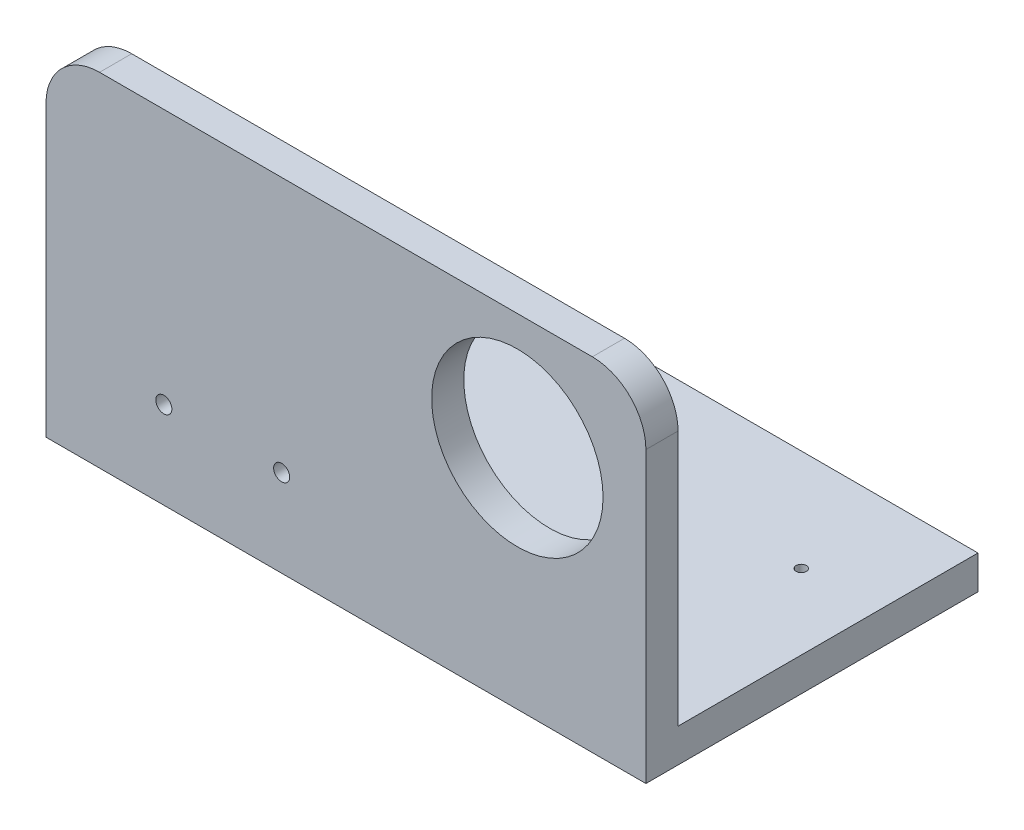
ISO-10303-21;
HEADER;
FILE_DESCRIPTION(('STEP AP214'),'2;1');
FILE_NAME('part.step','',(''),(''),'','','');
FILE_SCHEMA(('AUTOMOTIVE_DESIGN { 1 0 10303 214 1 1 1 1 }'));
ENDSEC;
DATA;
#1=APPLICATION_CONTEXT('core data for automotive mechanical design processes');
#2=APPLICATION_PROTOCOL_DEFINITION('international standard','automotive_design',2000,#1);
#3=PRODUCT_CONTEXT('',#1,'mechanical');
#4=PRODUCT('Part','Part','',(#3));
#5=PRODUCT_RELATED_PRODUCT_CATEGORY('part','',(#4));
#6=PRODUCT_DEFINITION_FORMATION('','',#4);
#7=PRODUCT_DEFINITION_CONTEXT('part definition',#1,'design');
#8=PRODUCT_DEFINITION('design','',#6,#7);
#9=PRODUCT_DEFINITION_SHAPE('','',#8);
#10=(LENGTH_UNIT() NAMED_UNIT(*) SI_UNIT(.MILLI.,.METRE.));
#11=(NAMED_UNIT(*) PLANE_ANGLE_UNIT() SI_UNIT($,.RADIAN.));
#12=(NAMED_UNIT(*) SI_UNIT($,.STERADIAN.) SOLID_ANGLE_UNIT());
#13=UNCERTAINTY_MEASURE_WITH_UNIT(LENGTH_MEASURE(1.E-05),#10,'distance_accuracy_value','');
#14=(GEOMETRIC_REPRESENTATION_CONTEXT(3) GLOBAL_UNCERTAINTY_ASSIGNED_CONTEXT((#13)) GLOBAL_UNIT_ASSIGNED_CONTEXT((#10,
#11,#12)) REPRESENTATION_CONTEXT('',''));
#15=CARTESIAN_POINT('',(0.,0.,0.));
#16=DIRECTION('',(0.,0.,1.));
#17=DIRECTION('',(1.,0.,0.));
#18=AXIS2_PLACEMENT_3D('',#15,#16,#17);
#19=CARTESIAN_POINT('',(0.,19.939,0.));
#20=DIRECTION('',(0.,-1.,0.));
#21=DIRECTION('',(0.,0.,-1.));
#22=AXIS2_PLACEMENT_3D('',#19,#20,#21);
#23=PLANE('',#22);
#24=CARTESIAN_POINT('',(311.15,19.939,-31.75));
#25=DIRECTION('',(0.,1.,0.));
#26=DIRECTION('',(0.,0.,1.));
#27=AXIS2_PLACEMENT_3D('',#24,#25,#26);
#28=CIRCLE('',#27,3.04800000000001);
#29=CARTESIAN_POINT('',(311.15,19.939,-28.702));
#30=VERTEX_POINT('',#29);
#31=EDGE_CURVE('E207',#30,#30,#28,.T.);
#32=ORIENTED_EDGE('',*,*,#31,.F.);
#33=EDGE_LOOP('',(#32));
#34=FACE_BOUND('',#33,.T.);
#35=CARTESIAN_POINT('',(95.25,19.939,-117.475));
#36=DIRECTION('',(0.,1.,0.));
#37=DIRECTION('',(0.,0.,1.));
#38=AXIS2_PLACEMENT_3D('',#35,#36,#37);
#39=CIRCLE('',#38,3.048);
#40=CARTESIAN_POINT('',(95.25,19.939,-114.427));
#41=VERTEX_POINT('',#40);
#42=EDGE_CURVE('E115',#41,#41,#39,.T.);
#43=ORIENTED_EDGE('',*,*,#42,.F.);
#44=EDGE_LOOP('',(#43));
#45=FACE_BOUND('',#44,.T.);
#46=DIRECTION('',(0.,0.,1.));
#47=VECTOR('',#46,1.);
#48=CARTESIAN_POINT('',(0.,19.939,0.));
#49=LINE('',#48,#47);
#50=CARTESIAN_POINT('',(0.,19.939,-177.8));
#51=VERTEX_POINT('',#50);
#52=CARTESIAN_POINT('',(0.,19.939,0.));
#53=VERTEX_POINT('',#52);
#54=EDGE_CURVE('E174',#51,#53,#49,.T.);
#55=ORIENTED_EDGE('',*,*,#54,.T.);
#56=DIRECTION('',(1.,0.,0.));
#57=VECTOR('',#56,1.);
#58=CARTESIAN_POINT('',(0.,19.939,0.));
#59=LINE('',#58,#57);
#60=CARTESIAN_POINT('',(355.6,19.939,0.));
#61=VERTEX_POINT('',#60);
#62=EDGE_CURVE('E177',#53,#61,#59,.T.);
#63=ORIENTED_EDGE('',*,*,#62,.T.);
#64=DIRECTION('',(0.,0.,-1.));
#65=VECTOR('',#64,1.);
#66=CARTESIAN_POINT('',(355.6,19.939,0.));
#67=LINE('',#66,#65);
#68=CARTESIAN_POINT('',(355.6,19.939,-177.8));
#69=VERTEX_POINT('',#68);
#70=EDGE_CURVE('E181',#61,#69,#67,.T.);
#71=ORIENTED_EDGE('',*,*,#70,.T.);
#72=DIRECTION('',(-1.,0.,0.));
#73=VECTOR('',#72,1.);
#74=CARTESIAN_POINT('',(0.,19.939,-177.8));
#75=LINE('',#74,#73);
#76=EDGE_CURVE('E183',#69,#51,#75,.T.);
#77=ORIENTED_EDGE('',*,*,#76,.T.);
#78=EDGE_LOOP('',(#55,#63,#71,#77));
#79=FACE_BOUND('',#78,.T.);
#80=CARTESIAN_POINT('',(311.15,19.939,-117.475));
#81=DIRECTION('',(0.,1.,0.));
#82=DIRECTION('',(0.,0.,1.));
#83=AXIS2_PLACEMENT_3D('',#80,#81,#82);
#84=CIRCLE('',#83,3.04800000000001);
#85=CARTESIAN_POINT('',(311.15,19.939,-114.427));
#86=VERTEX_POINT('',#85);
#87=EDGE_CURVE('E213',#86,#86,#84,.T.);
#88=ORIENTED_EDGE('',*,*,#87,.F.);
#89=EDGE_LOOP('',(#88));
#90=FACE_BOUND('',#89,.T.);
#91=CARTESIAN_POINT('',(95.25,19.939,-31.75));
#92=DIRECTION('',(0.,1.,0.));
#93=DIRECTION('',(0.,0.,1.));
#94=AXIS2_PLACEMENT_3D('',#91,#92,#93);
#95=CIRCLE('',#94,3.048);
#96=CARTESIAN_POINT('',(95.25,19.939,-28.702));
#97=VERTEX_POINT('',#96);
#98=EDGE_CURVE('E201',#97,#97,#95,.T.);
#99=ORIENTED_EDGE('',*,*,#98,.F.);
#100=EDGE_LOOP('',(#99));
#101=FACE_BOUND('',#100,.T.);
#102=ADVANCED_FACE('F32',(#34,#45,#79,#90,#101),#23,.F.);
#103=CARTESIAN_POINT('',(0.,0.,0.));
#104=DIRECTION('',(0.,-1.,0.));
#105=DIRECTION('',(0.,0.,-1.));
#106=AXIS2_PLACEMENT_3D('',#103,#104,#105);
#107=PLANE('',#106);
#108=CARTESIAN_POINT('',(311.15,0.,-31.75));
#109=DIRECTION('',(0.,1.,0.));
#110=DIRECTION('',(0.,0.,1.));
#111=AXIS2_PLACEMENT_3D('',#108,#109,#110);
#112=CIRCLE('',#111,3.04800000000001);
#113=CARTESIAN_POINT('',(311.15,0.,-28.702));
#114=VERTEX_POINT('',#113);
#115=EDGE_CURVE('E204',#114,#114,#112,.T.);
#116=ORIENTED_EDGE('',*,*,#115,.T.);
#117=EDGE_LOOP('',(#116));
#118=FACE_BOUND('',#117,.T.);
#119=CARTESIAN_POINT('',(95.25,0.,-117.475));
#120=DIRECTION('',(0.,1.,0.));
#121=DIRECTION('',(0.,0.,1.));
#122=AXIS2_PLACEMENT_3D('',#119,#120,#121);
#123=CIRCLE('',#122,3.048);
#124=CARTESIAN_POINT('',(95.25,0.,-114.427));
#125=VERTEX_POINT('',#124);
#126=EDGE_CURVE('E190',#125,#125,#123,.T.);
#127=ORIENTED_EDGE('',*,*,#126,.T.);
#128=EDGE_LOOP('',(#127));
#129=FACE_BOUND('',#128,.T.);
#130=DIRECTION('',(0.,0.,1.));
#131=VECTOR('',#130,1.);
#132=CARTESIAN_POINT('',(0.,0.,0.));
#133=LINE('',#132,#131);
#134=CARTESIAN_POINT('',(0.,0.,-177.8));
#135=VERTEX_POINT('',#134);
#136=CARTESIAN_POINT('',(0.,0.,19.05));
#137=VERTEX_POINT('',#136);
#138=EDGE_CURVE('E107',#135,#137,#133,.T.);
#139=ORIENTED_EDGE('',*,*,#138,.F.);
#140=DIRECTION('',(-1.,0.,0.));
#141=VECTOR('',#140,1.);
#142=CARTESIAN_POINT('',(0.,0.,-177.8));
#143=LINE('',#142,#141);
#144=CARTESIAN_POINT('',(355.6,0.,-177.8));
#145=VERTEX_POINT('',#144);
#146=EDGE_CURVE('E178',#145,#135,#143,.T.);
#147=ORIENTED_EDGE('',*,*,#146,.F.);
#148=DIRECTION('',(0.,0.,-1.));
#149=VECTOR('',#148,1.);
#150=CARTESIAN_POINT('',(355.6,0.,0.));
#151=LINE('',#150,#149);
#152=CARTESIAN_POINT('',(355.6,0.,19.05));
#153=VERTEX_POINT('',#152);
#154=EDGE_CURVE('E114',#153,#145,#151,.T.);
#155=ORIENTED_EDGE('',*,*,#154,.F.);
#156=DIRECTION('',(1.,0.,0.));
#157=VECTOR('',#156,1.);
#158=CARTESIAN_POINT('',(0.,0.,19.05));
#159=LINE('',#158,#157);
#160=EDGE_CURVE('E99',#137,#153,#159,.T.);
#161=ORIENTED_EDGE('',*,*,#160,.F.);
#162=EDGE_LOOP('',(#139,#147,#155,#161));
#163=FACE_BOUND('',#162,.T.);
#164=CARTESIAN_POINT('',(311.15,0.,-117.475));
#165=DIRECTION('',(0.,1.,0.));
#166=DIRECTION('',(0.,0.,1.));
#167=AXIS2_PLACEMENT_3D('',#164,#165,#166);
#168=CIRCLE('',#167,3.04800000000001);
#169=CARTESIAN_POINT('',(311.15,0.,-114.427));
#170=VERTEX_POINT('',#169);
#171=EDGE_CURVE('E210',#170,#170,#168,.T.);
#172=ORIENTED_EDGE('',*,*,#171,.T.);
#173=EDGE_LOOP('',(#172));
#174=FACE_BOUND('',#173,.T.);
#175=CARTESIAN_POINT('',(95.25,0.,-31.75));
#176=DIRECTION('',(0.,1.,0.));
#177=DIRECTION('',(0.,0.,1.));
#178=AXIS2_PLACEMENT_3D('',#175,#176,#177);
#179=CIRCLE('',#178,3.048);
#180=CARTESIAN_POINT('',(95.25,0.,-28.702));
#181=VERTEX_POINT('',#180);
#182=EDGE_CURVE('E102',#181,#181,#179,.T.);
#183=ORIENTED_EDGE('',*,*,#182,.T.);
#184=EDGE_LOOP('',(#183));
#185=FACE_BOUND('',#184,.T.);
#186=ADVANCED_FACE('F118',(#118,#129,#163,#174,#185),#107,.T.);
#187=CARTESIAN_POINT('',(0.,19.939,0.));
#188=DIRECTION('',(1.,0.,0.));
#189=DIRECTION('',(0.,0.,-1.));
#190=AXIS2_PLACEMENT_3D('',#187,#188,#189);
#191=PLANE('',#190);
#192=DIRECTION('',(0.,-1.,0.));
#193=VECTOR('',#192,1.);
#194=CARTESIAN_POINT('',(0.,203.2,19.05));
#195=LINE('',#194,#193);
#196=CARTESIAN_POINT('',(0.,171.45,19.05));
#197=VERTEX_POINT('',#196);
#198=EDGE_CURVE('E95',#197,#137,#195,.T.);
#199=ORIENTED_EDGE('',*,*,#198,.F.);
#200=DIRECTION('',(0.,0.,1.));
#201=VECTOR('',#200,1.);
#202=CARTESIAN_POINT('',(0.,171.45,0.));
#203=LINE('',#202,#201);
#204=CARTESIAN_POINT('',(0.,171.45,0.));
#205=VERTEX_POINT('',#204);
#206=EDGE_CURVE('E11',#197,#205,#203,.F.);
#207=ORIENTED_EDGE('',*,*,#206,.T.);
#208=DIRECTION('',(0.,-1.,0.));
#209=VECTOR('',#208,1.);
#210=CARTESIAN_POINT('',(0.,203.2,0.));
#211=LINE('',#210,#209);
#212=EDGE_CURVE('E136',#205,#53,#211,.T.);
#213=ORIENTED_EDGE('',*,*,#212,.T.);
#214=ORIENTED_EDGE('',*,*,#54,.F.);
#215=DIRECTION('',(0.,-1.,0.));
#216=VECTOR('',#215,1.);
#217=CARTESIAN_POINT('',(0.,19.939,-177.8));
#218=LINE('',#217,#216);
#219=EDGE_CURVE('E111',#51,#135,#218,.T.);
#220=ORIENTED_EDGE('',*,*,#219,.T.);
#221=ORIENTED_EDGE('',*,*,#138,.T.);
#222=EDGE_LOOP('',(#199,#207,#213,#214,#220,#221));
#223=FACE_BOUND('',#222,.T.);
#224=ADVANCED_FACE('F108',(#223),#191,.F.);
#225=CARTESIAN_POINT('',(355.6,19.939,0.));
#226=DIRECTION('',(-1.,0.,0.));
#227=DIRECTION('',(0.,0.,1.));
#228=AXIS2_PLACEMENT_3D('',#225,#226,#227);
#229=PLANE('',#228);
#230=DIRECTION('',(0.,-1.,0.));
#231=VECTOR('',#230,1.);
#232=CARTESIAN_POINT('',(355.6,203.2,0.));
#233=LINE('',#232,#231);
#234=CARTESIAN_POINT('',(355.6,171.45,0.));
#235=VERTEX_POINT('',#234);
#236=EDGE_CURVE('E139',#235,#61,#233,.T.);
#237=ORIENTED_EDGE('',*,*,#236,.F.);
#238=DIRECTION('',(0.,0.,-1.));
#239=VECTOR('',#238,1.);
#240=CARTESIAN_POINT('',(355.6,171.45,19.05));
#241=LINE('',#240,#239);
#242=CARTESIAN_POINT('',(355.6,171.45,19.05));
#243=VERTEX_POINT('',#242);
#244=EDGE_CURVE('E55',#235,#243,#241,.F.);
#245=ORIENTED_EDGE('',*,*,#244,.T.);
#246=DIRECTION('',(0.,-1.,0.));
#247=VECTOR('',#246,1.);
#248=CARTESIAN_POINT('',(355.6,203.2,19.05));
#249=LINE('',#248,#247);
#250=EDGE_CURVE('E103',#243,#153,#249,.T.);
#251=ORIENTED_EDGE('',*,*,#250,.T.);
#252=ORIENTED_EDGE('',*,*,#154,.T.);
#253=DIRECTION('',(0.,-1.,0.));
#254=VECTOR('',#253,1.);
#255=CARTESIAN_POINT('',(355.6,19.939,-177.8));
#256=LINE('',#255,#254);
#257=EDGE_CURVE('E160',#69,#145,#256,.T.);
#258=ORIENTED_EDGE('',*,*,#257,.F.);
#259=ORIENTED_EDGE('',*,*,#70,.F.);
#260=EDGE_LOOP('',(#237,#245,#251,#252,#258,#259));
#261=FACE_BOUND('',#260,.T.);
#262=ADVANCED_FACE('F199',(#261),#229,.F.);
#263=CARTESIAN_POINT('',(0.,19.939,-177.8));
#264=DIRECTION('',(0.,0.,1.));
#265=DIRECTION('',(1.,0.,0.));
#266=AXIS2_PLACEMENT_3D('',#263,#264,#265);
#267=PLANE('',#266);
#268=ORIENTED_EDGE('',*,*,#146,.T.);
#269=ORIENTED_EDGE('',*,*,#219,.F.);
#270=ORIENTED_EDGE('',*,*,#76,.F.);
#271=ORIENTED_EDGE('',*,*,#257,.T.);
#272=EDGE_LOOP('',(#268,#269,#270,#271));
#273=FACE_BOUND('',#272,.T.);
#274=ADVANCED_FACE('F195',(#273),#267,.F.);
#275=CARTESIAN_POINT('',(95.25,19.939,-117.475));
#276=DIRECTION('',(0.,-1.,0.));
#277=DIRECTION('',(0.,0.,-1.));
#278=AXIS2_PLACEMENT_3D('',#275,#276,#277);
#279=CYLINDRICAL_SURFACE('',#278,3.048);
#280=ORIENTED_EDGE('',*,*,#42,.T.);
#281=EDGE_LOOP('',(#280));
#282=FACE_BOUND('',#281,.T.);
#283=ORIENTED_EDGE('',*,*,#126,.F.);
#284=EDGE_LOOP('',(#283));
#285=FACE_BOUND('',#284,.T.);
#286=ADVANCED_FACE('F224',(#282,#285),#279,.F.);
#287=CARTESIAN_POINT('',(311.15,19.939,-117.475));
#288=DIRECTION('',(0.,-1.,0.));
#289=DIRECTION('',(0.,0.,-1.));
#290=AXIS2_PLACEMENT_3D('',#287,#288,#289);
#291=CYLINDRICAL_SURFACE('',#290,3.04800000000001);
#292=ORIENTED_EDGE('',*,*,#87,.T.);
#293=EDGE_LOOP('',(#292));
#294=FACE_BOUND('',#293,.T.);
#295=ORIENTED_EDGE('',*,*,#171,.F.);
#296=EDGE_LOOP('',(#295));
#297=FACE_BOUND('',#296,.T.);
#298=ADVANCED_FACE('F226',(#294,#297),#291,.F.);
#299=CARTESIAN_POINT('',(311.15,19.939,-31.75));
#300=DIRECTION('',(0.,-1.,0.));
#301=DIRECTION('',(0.,0.,-1.));
#302=AXIS2_PLACEMENT_3D('',#299,#300,#301);
#303=CYLINDRICAL_SURFACE('',#302,3.04800000000001);
#304=ORIENTED_EDGE('',*,*,#31,.T.);
#305=EDGE_LOOP('',(#304));
#306=FACE_BOUND('',#305,.T.);
#307=ORIENTED_EDGE('',*,*,#115,.F.);
#308=EDGE_LOOP('',(#307));
#309=FACE_BOUND('',#308,.T.);
#310=ADVANCED_FACE('F232',(#306,#309),#303,.F.);
#311=CARTESIAN_POINT('',(95.25,19.939,-31.75));
#312=DIRECTION('',(0.,-1.,0.));
#313=DIRECTION('',(0.,0.,-1.));
#314=AXIS2_PLACEMENT_3D('',#311,#312,#313);
#315=CYLINDRICAL_SURFACE('',#314,3.048);
#316=ORIENTED_EDGE('',*,*,#98,.T.);
#317=EDGE_LOOP('',(#316));
#318=FACE_BOUND('',#317,.T.);
#319=ORIENTED_EDGE('',*,*,#182,.F.);
#320=EDGE_LOOP('',(#319));
#321=FACE_BOUND('',#320,.T.);
#322=ADVANCED_FACE('F280',(#318,#321),#315,.F.);
#323=CARTESIAN_POINT('',(0.,203.2,19.05));
#324=DIRECTION('',(0.,0.,-1.));
#325=DIRECTION('',(-1.,0.,0.));
#326=AXIS2_PLACEMENT_3D('',#323,#324,#325);
#327=PLANE('',#326);
#328=CARTESIAN_POINT('',(139.7,51.689,19.05));
#329=DIRECTION('',(0.,0.,1.));
#330=DIRECTION('',(1.,0.,0.));
#331=AXIS2_PLACEMENT_3D('',#328,#329,#330);
#332=CIRCLE('',#331,4.76250000000001);
#333=CARTESIAN_POINT('',(144.4625,51.689,19.05));
#334=VERTEX_POINT('',#333);
#335=EDGE_CURVE('E168',#334,#334,#332,.T.);
#336=ORIENTED_EDGE('',*,*,#335,.F.);
#337=EDGE_LOOP('',(#336));
#338=FACE_BOUND('',#337,.T.);
#339=CARTESIAN_POINT('',(69.85,51.689,19.05));
#340=DIRECTION('',(0.,0.,1.));
#341=DIRECTION('',(1.,0.,0.));
#342=AXIS2_PLACEMENT_3D('',#339,#340,#341);
#343=CIRCLE('',#342,4.7625);
#344=CARTESIAN_POINT('',(74.6125,51.689,19.05));
#345=VERTEX_POINT('',#344);
#346=EDGE_CURVE('E167',#345,#345,#343,.T.);
#347=ORIENTED_EDGE('',*,*,#346,.F.);
#348=EDGE_LOOP('',(#347));
#349=FACE_BOUND('',#348,.T.);
#350=CARTESIAN_POINT('',(279.4,134.239,19.05));
#351=DIRECTION('',(0.,0.,1.));
#352=DIRECTION('',(1.,0.,0.));
#353=AXIS2_PLACEMENT_3D('',#350,#351,#352);
#354=CIRCLE('',#353,50.8);
#355=CARTESIAN_POINT('',(330.2,134.239,19.05));
#356=VERTEX_POINT('',#355);
#357=EDGE_CURVE('E127',#356,#356,#354,.T.);
#358=ORIENTED_EDGE('',*,*,#357,.F.);
#359=EDGE_LOOP('',(#358));
#360=FACE_BOUND('',#359,.T.);
#361=ORIENTED_EDGE('',*,*,#250,.F.);
#362=CARTESIAN_POINT('',(323.85,171.45,19.05));
#363=DIRECTION('',(0.,0.,-1.));
#364=DIRECTION('',(-1.,0.,0.));
#365=AXIS2_PLACEMENT_3D('',#362,#363,#364);
#366=CIRCLE('',#365,31.75);
#367=CARTESIAN_POINT('',(323.85,203.2,19.05));
#368=VERTEX_POINT('',#367);
#369=EDGE_CURVE('E40',#243,#368,#366,.F.);
#370=ORIENTED_EDGE('',*,*,#369,.T.);
#371=DIRECTION('',(1.,0.,0.));
#372=VECTOR('',#371,1.);
#373=CARTESIAN_POINT('',(0.,203.2,19.05));
#374=LINE('',#373,#372);
#375=CARTESIAN_POINT('',(31.75,203.2,19.05));
#376=VERTEX_POINT('',#375);
#377=EDGE_CURVE('E120',#376,#368,#374,.T.);
#378=ORIENTED_EDGE('',*,*,#377,.F.);
#379=CARTESIAN_POINT('',(31.75,171.45,19.05));
#380=DIRECTION('',(0.,0.,-1.));
#381=DIRECTION('',(-1.,0.,0.));
#382=AXIS2_PLACEMENT_3D('',#379,#380,#381);
#383=CIRCLE('',#382,31.75);
#384=EDGE_CURVE('E47',#376,#197,#383,.F.);
#385=ORIENTED_EDGE('',*,*,#384,.T.);
#386=ORIENTED_EDGE('',*,*,#198,.T.);
#387=ORIENTED_EDGE('',*,*,#160,.T.);
#388=EDGE_LOOP('',(#361,#370,#378,#385,#386,#387));
#389=FACE_BOUND('',#388,.T.);
#390=ADVANCED_FACE('F97',(#338,#349,#360,#389),#327,.F.);
#391=CARTESIAN_POINT('',(0.,203.2,0.));
#392=DIRECTION('',(0.,0.,1.));
#393=DIRECTION('',(1.,0.,0.));
#394=AXIS2_PLACEMENT_3D('',#391,#392,#393);
#395=PLANE('',#394);
#396=CARTESIAN_POINT('',(139.7,51.689,0.));
#397=DIRECTION('',(0.,0.,1.));
#398=DIRECTION('',(1.,0.,0.));
#399=AXIS2_PLACEMENT_3D('',#396,#397,#398);
#400=CIRCLE('',#399,4.76250000000001);
#401=CARTESIAN_POINT('',(144.4625,51.689,0.));
#402=VERTEX_POINT('',#401);
#403=EDGE_CURVE('E164',#402,#402,#400,.T.);
#404=ORIENTED_EDGE('',*,*,#403,.T.);
#405=EDGE_LOOP('',(#404));
#406=FACE_BOUND('',#405,.T.);
#407=CARTESIAN_POINT('',(69.85,51.689,0.));
#408=DIRECTION('',(0.,0.,1.));
#409=DIRECTION('',(1.,0.,0.));
#410=AXIS2_PLACEMENT_3D('',#407,#408,#409);
#411=CIRCLE('',#410,4.7625);
#412=CARTESIAN_POINT('',(74.6125,51.689,0.));
#413=VERTEX_POINT('',#412);
#414=EDGE_CURVE('E169',#413,#413,#411,.T.);
#415=ORIENTED_EDGE('',*,*,#414,.T.);
#416=EDGE_LOOP('',(#415));
#417=FACE_BOUND('',#416,.T.);
#418=CARTESIAN_POINT('',(279.4,134.239,0.));
#419=DIRECTION('',(0.,0.,1.));
#420=DIRECTION('',(1.,0.,0.));
#421=AXIS2_PLACEMENT_3D('',#418,#419,#420);
#422=CIRCLE('',#421,50.8);
#423=CARTESIAN_POINT('',(330.2,134.239,0.));
#424=VERTEX_POINT('',#423);
#425=EDGE_CURVE('E121',#424,#424,#422,.T.);
#426=ORIENTED_EDGE('',*,*,#425,.T.);
#427=EDGE_LOOP('',(#426));
#428=FACE_BOUND('',#427,.T.);
#429=DIRECTION('',(-1.,0.,0.));
#430=VECTOR('',#429,1.);
#431=CARTESIAN_POINT('',(0.,203.2,0.));
#432=LINE('',#431,#430);
#433=CARTESIAN_POINT('',(323.85,203.2,0.));
#434=VERTEX_POINT('',#433);
#435=CARTESIAN_POINT('',(31.75,203.2,0.));
#436=VERTEX_POINT('',#435);
#437=EDGE_CURVE('E124',#434,#436,#432,.T.);
#438=ORIENTED_EDGE('',*,*,#437,.F.);
#439=CARTESIAN_POINT('',(323.85,171.45,0.));
#440=DIRECTION('',(0.,0.,1.));
#441=DIRECTION('',(1.,0.,0.));
#442=AXIS2_PLACEMENT_3D('',#439,#440,#441);
#443=CIRCLE('',#442,31.75);
#444=EDGE_CURVE('E145',#434,#235,#443,.F.);
#445=ORIENTED_EDGE('',*,*,#444,.T.);
#446=ORIENTED_EDGE('',*,*,#236,.T.);
#447=ORIENTED_EDGE('',*,*,#62,.F.);
#448=ORIENTED_EDGE('',*,*,#212,.F.);
#449=CARTESIAN_POINT('',(31.75,171.45,0.));
#450=DIRECTION('',(0.,0.,1.));
#451=DIRECTION('',(1.,0.,0.));
#452=AXIS2_PLACEMENT_3D('',#449,#450,#451);
#453=CIRCLE('',#452,31.75);
#454=EDGE_CURVE('E143',#205,#436,#453,.F.);
#455=ORIENTED_EDGE('',*,*,#454,.T.);
#456=EDGE_LOOP('',(#438,#445,#446,#447,#448,#455));
#457=FACE_BOUND('',#456,.T.);
#458=ADVANCED_FACE('F274',(#406,#417,#428,#457),#395,.F.);
#459=CARTESIAN_POINT('',(0.,203.2,0.));
#460=DIRECTION('',(0.,1.,0.));
#461=DIRECTION('',(0.,0.,1.));
#462=AXIS2_PLACEMENT_3D('',#459,#460,#461);
#463=PLANE('',#462);
#464=ORIENTED_EDGE('',*,*,#377,.T.);
#465=DIRECTION('',(0.,0.,-1.));
#466=VECTOR('',#465,1.);
#467=CARTESIAN_POINT('',(323.85,203.2,0.));
#468=LINE('',#467,#466);
#469=EDGE_CURVE('E140',#368,#434,#468,.T.);
#470=ORIENTED_EDGE('',*,*,#469,.T.);
#471=ORIENTED_EDGE('',*,*,#437,.T.);
#472=DIRECTION('',(0.,0.,1.));
#473=VECTOR('',#472,1.);
#474=CARTESIAN_POINT('',(31.75,203.2,19.05));
#475=LINE('',#474,#473);
#476=EDGE_CURVE('E158',#436,#376,#475,.T.);
#477=ORIENTED_EDGE('',*,*,#476,.T.);
#478=EDGE_LOOP('',(#464,#470,#471,#477));
#479=FACE_BOUND('',#478,.T.);
#480=ADVANCED_FACE('F154',(#479),#463,.T.);
#481=CARTESIAN_POINT('',(279.4,134.239,-177.800025));
#482=DIRECTION('',(0.,0.,1.));
#483=DIRECTION('',(1.,0.,0.));
#484=AXIS2_PLACEMENT_3D('',#481,#482,#483);
#485=CYLINDRICAL_SURFACE('',#484,50.8);
#486=ORIENTED_EDGE('',*,*,#357,.T.);
#487=EDGE_LOOP('',(#486));
#488=FACE_BOUND('',#487,.T.);
#489=ORIENTED_EDGE('',*,*,#425,.F.);
#490=EDGE_LOOP('',(#489));
#491=FACE_BOUND('',#490,.T.);
#492=ADVANCED_FACE('F263',(#488,#491),#485,.F.);
#493=CARTESIAN_POINT('',(69.85,51.689,-177.800025));
#494=DIRECTION('',(0.,0.,1.));
#495=DIRECTION('',(1.,0.,0.));
#496=AXIS2_PLACEMENT_3D('',#493,#494,#495);
#497=CYLINDRICAL_SURFACE('',#496,4.7625);
#498=ORIENTED_EDGE('',*,*,#346,.T.);
#499=EDGE_LOOP('',(#498));
#500=FACE_BOUND('',#499,.T.);
#501=ORIENTED_EDGE('',*,*,#414,.F.);
#502=EDGE_LOOP('',(#501));
#503=FACE_BOUND('',#502,.T.);
#504=ADVANCED_FACE('F257',(#500,#503),#497,.F.);
#505=CARTESIAN_POINT('',(139.7,51.689,-177.800025));
#506=DIRECTION('',(0.,0.,1.));
#507=DIRECTION('',(1.,0.,0.));
#508=AXIS2_PLACEMENT_3D('',#505,#506,#507);
#509=CYLINDRICAL_SURFACE('',#508,4.76250000000001);
#510=ORIENTED_EDGE('',*,*,#335,.T.);
#511=EDGE_LOOP('',(#510));
#512=FACE_BOUND('',#511,.T.);
#513=ORIENTED_EDGE('',*,*,#403,.F.);
#514=EDGE_LOOP('',(#513));
#515=FACE_BOUND('',#514,.T.);
#516=ADVANCED_FACE('F251',(#512,#515),#509,.F.);
#517=CARTESIAN_POINT('',(323.85,171.45,0.));
#518=DIRECTION('',(0.,0.,1.));
#519=DIRECTION('',(1.,0.,0.));
#520=AXIS2_PLACEMENT_3D('',#517,#518,#519);
#521=CYLINDRICAL_SURFACE('',#520,31.75);
#522=ORIENTED_EDGE('',*,*,#369,.F.);
#523=ORIENTED_EDGE('',*,*,#244,.F.);
#524=ORIENTED_EDGE('',*,*,#444,.F.);
#525=ORIENTED_EDGE('',*,*,#469,.F.);
#526=EDGE_LOOP('',(#522,#523,#524,#525));
#527=FACE_BOUND('',#526,.T.);
#528=ADVANCED_FACE('F159',(#527),#521,.T.);
#529=CARTESIAN_POINT('',(31.75,171.45,0.));
#530=DIRECTION('',(0.,0.,-1.));
#531=DIRECTION('',(-1.,0.,0.));
#532=AXIS2_PLACEMENT_3D('',#529,#530,#531);
#533=CYLINDRICAL_SURFACE('',#532,31.75);
#534=ORIENTED_EDGE('',*,*,#454,.F.);
#535=ORIENTED_EDGE('',*,*,#206,.F.);
#536=ORIENTED_EDGE('',*,*,#384,.F.);
#537=ORIENTED_EDGE('',*,*,#476,.F.);
#538=EDGE_LOOP('',(#534,#535,#536,#537));
#539=FACE_BOUND('',#538,.T.);
#540=ADVANCED_FACE('F34',(#539),#533,.T.);
#541=CLOSED_SHELL('',(#102,#186,#224,#262,#274,#286,#298,#310,#322,#390,#458,#480,#492,#504,
#516,#528,#540));
#542=MANIFOLD_SOLID_BREP('B2',#541);
#543=ADVANCED_BREP_SHAPE_REPRESENTATION('',(#18,#542),#14);
#544=SHAPE_DEFINITION_REPRESENTATION(#9,#543);
ENDSEC;
END-ISO-10303-21;
